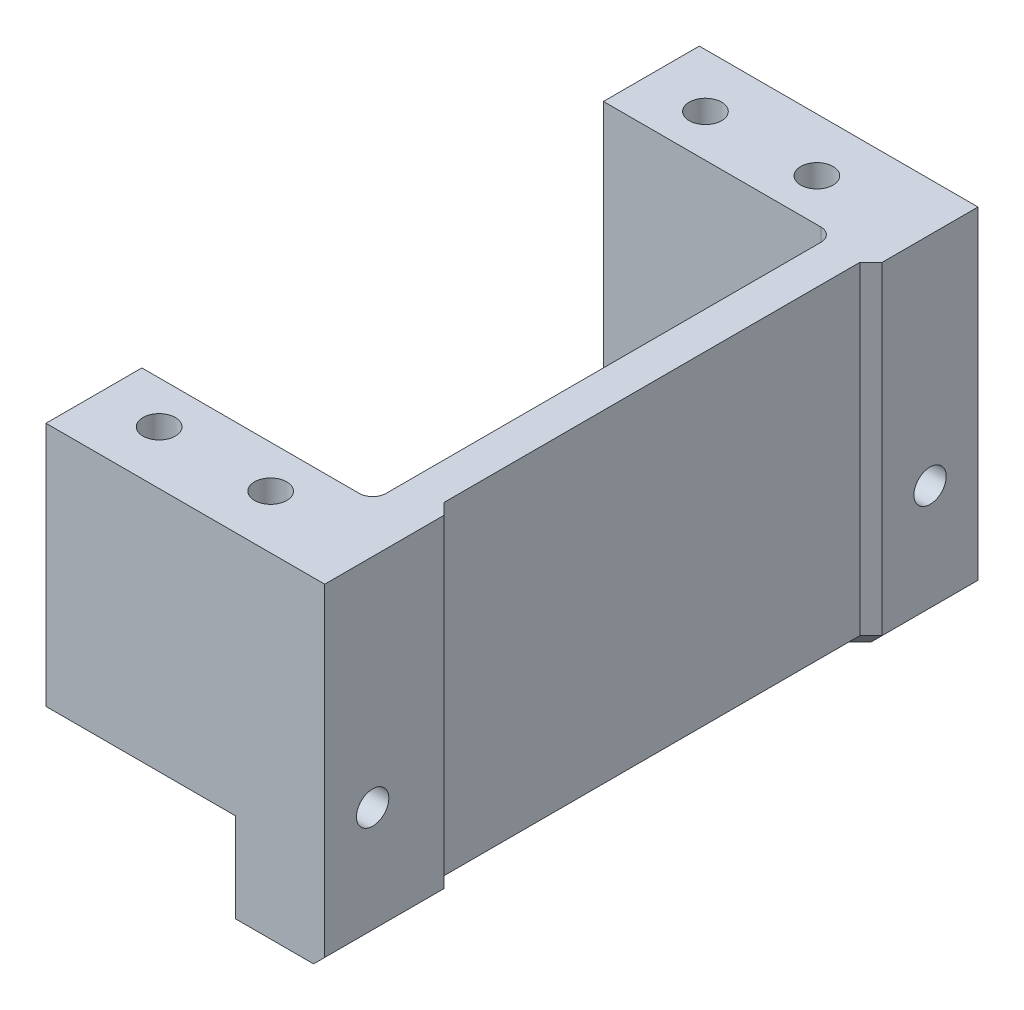
ISO-10303-21;
HEADER;
FILE_DESCRIPTION(('STEP AP214'),'2;1');
FILE_NAME('part.step','',(''),(''),'','','');
FILE_SCHEMA(('AUTOMOTIVE_DESIGN { 1 0 10303 214 1 1 1 1 }'));
ENDSEC;
DATA;
#1=APPLICATION_CONTEXT('core data for automotive mechanical design processes');
#2=APPLICATION_PROTOCOL_DEFINITION('international standard','automotive_design',2000,#1);
#3=PRODUCT_CONTEXT('',#1,'mechanical');
#4=PRODUCT('Part','Part','',(#3));
#5=PRODUCT_RELATED_PRODUCT_CATEGORY('part','',(#4));
#6=PRODUCT_DEFINITION_FORMATION('','',#4);
#7=PRODUCT_DEFINITION_CONTEXT('part definition',#1,'design');
#8=PRODUCT_DEFINITION('design','',#6,#7);
#9=PRODUCT_DEFINITION_SHAPE('','',#8);
#10=(LENGTH_UNIT() NAMED_UNIT(*) SI_UNIT(.MILLI.,.METRE.));
#11=(NAMED_UNIT(*) PLANE_ANGLE_UNIT() SI_UNIT($,.RADIAN.));
#12=(NAMED_UNIT(*) SI_UNIT($,.STERADIAN.) SOLID_ANGLE_UNIT());
#13=UNCERTAINTY_MEASURE_WITH_UNIT(LENGTH_MEASURE(1.E-05),#10,'distance_accuracy_value','');
#14=(GEOMETRIC_REPRESENTATION_CONTEXT(3) GLOBAL_UNCERTAINTY_ASSIGNED_CONTEXT((#13)) GLOBAL_UNIT_ASSIGNED_CONTEXT((#10,
#11,#12)) REPRESENTATION_CONTEXT('',''));
#15=CARTESIAN_POINT('',(0.,0.,0.));
#16=DIRECTION('',(0.,0.,1.));
#17=DIRECTION('',(1.,0.,0.));
#18=AXIS2_PLACEMENT_3D('',#15,#16,#17);
#19=CARTESIAN_POINT('',(10.,0.,19.5));
#20=DIRECTION('',(0.,1.,0.));
#21=DIRECTION('',(0.,0.,1.));
#22=AXIS2_PLACEMENT_3D('',#19,#20,#21);
#23=PLANE('',#22);
#24=DIRECTION('',(-0.707106781186554,0.,-0.707106781186541));
#25=VECTOR('',#24,1.);
#26=CARTESIAN_POINT('',(13.5,0.,17.5906962402754));
#27=LINE('',#26,#25);
#28=CARTESIAN_POINT('',(14.5,0.,18.5906962402754));
#29=VERTEX_POINT('',#28);
#30=CARTESIAN_POINT('',(13.5,0.,17.5906962402754));
#31=VERTEX_POINT('',#30);
#32=EDGE_CURVE('E357',#29,#31,#27,.T.);
#33=ORIENTED_EDGE('',*,*,#32,.F.);
#34=DIRECTION('',(0.,0.,1.));
#35=VECTOR('',#34,1.);
#36=CARTESIAN_POINT('',(14.5,0.,19.5));
#37=LINE('',#36,#35);
#38=CARTESIAN_POINT('',(14.5,0.,29.3));
#39=VERTEX_POINT('',#38);
#40=EDGE_CURVE('E67',#29,#39,#37,.T.);
#41=ORIENTED_EDGE('',*,*,#40,.T.);
#42=DIRECTION('',(1.,0.,0.));
#43=VECTOR('',#42,1.);
#44=CARTESIAN_POINT('',(15.5,0.,29.3));
#45=LINE('',#44,#43);
#46=CARTESIAN_POINT('',(7.50000000000001,0.,29.3));
#47=VERTEX_POINT('',#46);
#48=EDGE_CURVE('E325',#47,#39,#45,.T.);
#49=ORIENTED_EDGE('',*,*,#48,.F.);
#50=DIRECTION('',(0.,0.,1.));
#51=VECTOR('',#50,1.);
#52=CARTESIAN_POINT('',(7.5,0.,20.7));
#53=LINE('',#52,#51);
#54=CARTESIAN_POINT('',(7.5,0.,21.7));
#55=VERTEX_POINT('',#54);
#56=EDGE_CURVE('E582',#55,#47,#53,.T.);
#57=ORIENTED_EDGE('',*,*,#56,.F.);
#58=DIRECTION('',(1.,0.,0.));
#59=VECTOR('',#58,1.);
#60=CARTESIAN_POINT('',(10.,0.,21.7));
#61=LINE('',#60,#59);
#62=CARTESIAN_POINT('',(10.,0.,21.7));
#63=VERTEX_POINT('',#62);
#64=EDGE_CURVE('E375',#55,#63,#61,.T.);
#65=ORIENTED_EDGE('',*,*,#64,.T.);
#66=CARTESIAN_POINT('',(10.,0.,19.5));
#67=DIRECTION('',(0.,1.,0.));
#68=DIRECTION('',(0.,0.,1.));
#69=AXIS2_PLACEMENT_3D('',#66,#67,#68);
#70=CIRCLE('',#69,2.19999999999999);
#71=CARTESIAN_POINT('',(12.2,0.,19.5));
#72=VERTEX_POINT('',#71);
#73=EDGE_CURVE('E369',#63,#72,#70,.T.);
#74=ORIENTED_EDGE('',*,*,#73,.T.);
#75=DIRECTION('',(0.,0.,-1.));
#76=VECTOR('',#75,1.);
#77=CARTESIAN_POINT('',(12.2,0.,19.5));
#78=LINE('',#77,#76);
#79=CARTESIAN_POINT('',(12.2,0.,-19.5));
#80=VERTEX_POINT('',#79);
#81=EDGE_CURVE('E361',#72,#80,#78,.T.);
#82=ORIENTED_EDGE('',*,*,#81,.T.);
#83=CARTESIAN_POINT('',(10.,0.,-19.5));
#84=DIRECTION('',(0.,1.,0.));
#85=DIRECTION('',(0.,0.,1.));
#86=AXIS2_PLACEMENT_3D('',#83,#84,#85);
#87=CIRCLE('',#86,2.19999999999999);
#88=CARTESIAN_POINT('',(10.,0.,-21.7));
#89=VERTEX_POINT('',#88);
#90=EDGE_CURVE('E372',#80,#89,#87,.T.);
#91=ORIENTED_EDGE('',*,*,#90,.T.);
#92=DIRECTION('',(-1.,0.,0.));
#93=VECTOR('',#92,1.);
#94=CARTESIAN_POINT('',(9.99999999999999,0.,-21.7));
#95=LINE('',#94,#93);
#96=CARTESIAN_POINT('',(7.5,0.,-21.7));
#97=VERTEX_POINT('',#96);
#98=EDGE_CURVE('E378',#89,#97,#95,.T.);
#99=ORIENTED_EDGE('',*,*,#98,.T.);
#100=DIRECTION('',(0.,0.,1.));
#101=VECTOR('',#100,1.);
#102=CARTESIAN_POINT('',(7.5,0.,-20.7));
#103=LINE('',#102,#101);
#104=CARTESIAN_POINT('',(7.49999999999999,0.,-29.3));
#105=VERTEX_POINT('',#104);
#106=EDGE_CURVE('E323',#105,#97,#103,.T.);
#107=ORIENTED_EDGE('',*,*,#106,.F.);
#108=DIRECTION('',(-1.,0.,0.));
#109=VECTOR('',#108,1.);
#110=CARTESIAN_POINT('',(-9.5,0.,-29.3));
#111=LINE('',#110,#109);
#112=CARTESIAN_POINT('',(14.5,0.,-29.3));
#113=VERTEX_POINT('',#112);
#114=EDGE_CURVE('E316',#113,#105,#111,.T.);
#115=ORIENTED_EDGE('',*,*,#114,.F.);
#116=DIRECTION('',(0.,0.,1.));
#117=VECTOR('',#116,1.);
#118=CARTESIAN_POINT('',(14.5,0.,19.5));
#119=LINE('',#118,#117);
#120=CARTESIAN_POINT('',(14.5,0.,-20.7));
#121=VERTEX_POINT('',#120);
#122=EDGE_CURVE('E300',#113,#121,#119,.T.);
#123=ORIENTED_EDGE('',*,*,#122,.T.);
#124=DIRECTION('',(0.707106781186552,0.,-0.707106781186543));
#125=VECTOR('',#124,1.);
#126=CARTESIAN_POINT('',(15.5,0.,-21.7));
#127=LINE('',#126,#125);
#128=CARTESIAN_POINT('',(13.5,0.,-19.7));
#129=VERTEX_POINT('',#128);
#130=EDGE_CURVE('E333',#129,#121,#127,.T.);
#131=ORIENTED_EDGE('',*,*,#130,.F.);
#132=DIRECTION('',(0.,0.,1.));
#133=VECTOR('',#132,1.);
#134=CARTESIAN_POINT('',(13.5,0.,19.5));
#135=LINE('',#134,#133);
#136=EDGE_CURVE('E353',#129,#31,#135,.T.);
#137=ORIENTED_EDGE('',*,*,#136,.T.);
#138=EDGE_LOOP('',(#33,#41,#49,#57,#65,#74,#82,#91,#99,#107,#115,#123,#131,#137));
#139=FACE_BOUND('',#138,.T.);
#140=ADVANCED_FACE('F43',(#139),#23,.F.);
#141=CARTESIAN_POINT('',(15.5,30.,-29.3));
#142=DIRECTION('',(-1.,0.,0.));
#143=DIRECTION('',(0.,0.,1.));
#144=AXIS2_PLACEMENT_3D('',#141,#142,#143);
#145=PLANE('',#144);
#146=CARTESIAN_POINT('',(15.5,10.5,-25.));
#147=DIRECTION('',(1.,0.,0.));
#148=DIRECTION('',(0.,0.,-1.));
#149=AXIS2_PLACEMENT_3D('',#146,#147,#148);
#150=CIRCLE('',#149,1.45);
#151=CARTESIAN_POINT('',(15.5,10.5,-26.45));
#152=VERTEX_POINT('',#151);
#153=EDGE_CURVE('E532',#152,#152,#150,.T.);
#154=ORIENTED_EDGE('',*,*,#153,.F.);
#155=EDGE_LOOP('',(#154));
#156=FACE_BOUND('',#155,.T.);
#157=DIRECTION('',(0.,-1.,0.));
#158=VECTOR('',#157,1.);
#159=CARTESIAN_POINT('',(15.5,30.,-20.7));
#160=LINE('',#159,#158);
#161=CARTESIAN_POINT('',(15.5,30.,-20.7));
#162=VERTEX_POINT('',#161);
#163=CARTESIAN_POINT('',(15.5,0.99999999999998,-20.7));
#164=VERTEX_POINT('',#163);
#165=EDGE_CURVE('E238',#162,#164,#160,.T.);
#166=ORIENTED_EDGE('',*,*,#165,.T.);
#167=DIRECTION('',(0.,0.,-1.));
#168=VECTOR('',#167,1.);
#169=CARTESIAN_POINT('',(15.5,1.00000000000001,-29.3));
#170=LINE('',#169,#168);
#171=CARTESIAN_POINT('',(15.5,1.00000000000001,-29.3));
#172=VERTEX_POINT('',#171);
#173=EDGE_CURVE('E308',#164,#172,#170,.T.);
#174=ORIENTED_EDGE('',*,*,#173,.T.);
#175=DIRECTION('',(0.,-1.,0.));
#176=VECTOR('',#175,1.);
#177=CARTESIAN_POINT('',(15.5,30.,-29.3));
#178=LINE('',#177,#176);
#179=CARTESIAN_POINT('',(15.5,30.,-29.3));
#180=VERTEX_POINT('',#179);
#181=EDGE_CURVE('E251',#180,#172,#178,.T.);
#182=ORIENTED_EDGE('',*,*,#181,.F.);
#183=DIRECTION('',(0.,0.,-1.));
#184=VECTOR('',#183,1.);
#185=CARTESIAN_POINT('',(15.5,30.,-29.3));
#186=LINE('',#185,#184);
#187=EDGE_CURVE('E252',#162,#180,#186,.T.);
#188=ORIENTED_EDGE('',*,*,#187,.F.);
#189=EDGE_LOOP('',(#166,#174,#182,#188));
#190=FACE_BOUND('',#189,.T.);
#191=ADVANCED_FACE('F337',(#156,#190),#145,.F.);
#192=CARTESIAN_POINT('',(-9.5,30.,-29.3));
#193=DIRECTION('',(0.,0.,1.));
#194=DIRECTION('',(1.,0.,0.));
#195=AXIS2_PLACEMENT_3D('',#192,#193,#194);
#196=PLANE('',#195);
#197=ORIENTED_EDGE('',*,*,#181,.T.);
#198=DIRECTION('',(0.707106781186548,0.707106781186548,0.));
#199=VECTOR('',#198,1.);
#200=CARTESIAN_POINT('',(15.5,1.00000000000001,-29.3));
#201=LINE('',#200,#199);
#202=EDGE_CURVE('E53',#172,#113,#201,.F.);
#203=ORIENTED_EDGE('',*,*,#202,.T.);
#204=ORIENTED_EDGE('',*,*,#114,.T.);
#205=DIRECTION('',(0.,-1.,0.));
#206=VECTOR('',#205,1.);
#207=CARTESIAN_POINT('',(7.49999999999999,0.,-29.3));
#208=LINE('',#207,#206);
#209=CARTESIAN_POINT('',(7.49999999999999,8.,-29.3));
#210=VERTEX_POINT('',#209);
#211=EDGE_CURVE('E557',#210,#105,#208,.T.);
#212=ORIENTED_EDGE('',*,*,#211,.F.);
#213=DIRECTION('',(-1.,0.,0.));
#214=VECTOR('',#213,1.);
#215=CARTESIAN_POINT('',(7.49999999999999,8.,-29.3));
#216=LINE('',#215,#214);
#217=CARTESIAN_POINT('',(-9.50000000000001,8.,-29.3));
#218=VERTEX_POINT('',#217);
#219=EDGE_CURVE('E548',#210,#218,#216,.T.);
#220=ORIENTED_EDGE('',*,*,#219,.T.);
#221=DIRECTION('',(0.,-1.,0.));
#222=VECTOR('',#221,1.);
#223=CARTESIAN_POINT('',(-9.5,30.,-29.3));
#224=LINE('',#223,#222);
#225=CARTESIAN_POINT('',(-9.5,30.,-29.3));
#226=VERTEX_POINT('',#225);
#227=EDGE_CURVE('E446',#226,#218,#224,.T.);
#228=ORIENTED_EDGE('',*,*,#227,.F.);
#229=DIRECTION('',(-1.,0.,0.));
#230=VECTOR('',#229,1.);
#231=CARTESIAN_POINT('',(-9.5,30.,-29.3));
#232=LINE('',#231,#230);
#233=EDGE_CURVE('E490',#180,#226,#232,.T.);
#234=ORIENTED_EDGE('',*,*,#233,.F.);
#235=EDGE_LOOP('',(#197,#203,#204,#212,#220,#228,#234));
#236=FACE_BOUND('',#235,.T.);
#237=ADVANCED_FACE('F314',(#236),#196,.F.);
#238=CARTESIAN_POINT('',(-9.50000000000001,30.,-20.7));
#239=DIRECTION('',(1.,0.,0.));
#240=DIRECTION('',(0.,0.,-1.));
#241=AXIS2_PLACEMENT_3D('',#238,#239,#240);
#242=PLANE('',#241);
#243=ORIENTED_EDGE('',*,*,#227,.T.);
#244=DIRECTION('',(0.,0.,-1.));
#245=VECTOR('',#244,1.);
#246=CARTESIAN_POINT('',(-9.50000000000001,8.,-20.7));
#247=LINE('',#246,#245);
#248=CARTESIAN_POINT('',(-9.50000000000001,8.,-20.7));
#249=VERTEX_POINT('',#248);
#250=EDGE_CURVE('E341',#249,#218,#247,.T.);
#251=ORIENTED_EDGE('',*,*,#250,.F.);
#252=DIRECTION('',(0.,-1.,0.));
#253=VECTOR('',#252,1.);
#254=CARTESIAN_POINT('',(-9.50000000000001,30.,-20.7));
#255=LINE('',#254,#253);
#256=CARTESIAN_POINT('',(-9.50000000000001,30.,-20.7));
#257=VERTEX_POINT('',#256);
#258=EDGE_CURVE('E442',#257,#249,#255,.T.);
#259=ORIENTED_EDGE('',*,*,#258,.F.);
#260=DIRECTION('',(0.,0.,1.));
#261=VECTOR('',#260,1.);
#262=CARTESIAN_POINT('',(-9.50000000000001,30.,-20.7));
#263=LINE('',#262,#261);
#264=EDGE_CURVE('E476',#226,#257,#263,.T.);
#265=ORIENTED_EDGE('',*,*,#264,.F.);
#266=EDGE_LOOP('',(#243,#251,#259,#265));
#267=FACE_BOUND('',#266,.T.);
#268=ADVANCED_FACE('F592',(#267),#242,.F.);
#269=CARTESIAN_POINT('',(10.,30.,-20.7));
#270=DIRECTION('',(0.,0.,-1.));
#271=DIRECTION('',(-1.,0.,0.));
#272=AXIS2_PLACEMENT_3D('',#269,#270,#271);
#273=PLANE('',#272);
#274=DIRECTION('',(0.,1.,0.));
#275=VECTOR('',#274,1.);
#276=CARTESIAN_POINT('',(7.5,0.,-20.7));
#277=LINE('',#276,#275);
#278=CARTESIAN_POINT('',(7.5,0.999999999999994,-20.7));
#279=VERTEX_POINT('',#278);
#280=CARTESIAN_POINT('',(7.5,8.,-20.7));
#281=VERTEX_POINT('',#280);
#282=EDGE_CURVE('E459',#279,#281,#277,.T.);
#283=ORIENTED_EDGE('',*,*,#282,.F.);
#284=DIRECTION('',(1.,0.,0.));
#285=VECTOR('',#284,1.);
#286=CARTESIAN_POINT('',(10.,0.999999999999994,-20.7));
#287=LINE('',#286,#285);
#288=CARTESIAN_POINT('',(10.,0.999999999999994,-20.7));
#289=VERTEX_POINT('',#288);
#290=EDGE_CURVE('E363',#279,#289,#287,.T.);
#291=ORIENTED_EDGE('',*,*,#290,.T.);
#292=DIRECTION('',(0.,-1.,0.));
#293=VECTOR('',#292,1.);
#294=CARTESIAN_POINT('',(10.,30.,-20.7));
#295=LINE('',#294,#293);
#296=CARTESIAN_POINT('',(10.,30.,-20.7));
#297=VERTEX_POINT('',#296);
#298=EDGE_CURVE('E438',#297,#289,#295,.T.);
#299=ORIENTED_EDGE('',*,*,#298,.F.);
#300=DIRECTION('',(1.,0.,0.));
#301=VECTOR('',#300,1.);
#302=CARTESIAN_POINT('',(10.,30.,-20.7));
#303=LINE('',#302,#301);
#304=EDGE_CURVE('E470',#257,#297,#303,.T.);
#305=ORIENTED_EDGE('',*,*,#304,.F.);
#306=ORIENTED_EDGE('',*,*,#258,.T.);
#307=DIRECTION('',(-1.,0.,0.));
#308=VECTOR('',#307,1.);
#309=CARTESIAN_POINT('',(7.5,8.,-20.7));
#310=LINE('',#309,#308);
#311=EDGE_CURVE('E545',#281,#249,#310,.T.);
#312=ORIENTED_EDGE('',*,*,#311,.F.);
#313=EDGE_LOOP('',(#283,#291,#299,#305,#306,#312));
#314=FACE_BOUND('',#313,.T.);
#315=ADVANCED_FACE('F455',(#314),#273,.F.);
#316=CARTESIAN_POINT('',(10.,30.,-19.5));
#317=DIRECTION('',(0.,-1.,0.));
#318=DIRECTION('',(0.,0.,-1.));
#319=AXIS2_PLACEMENT_3D('',#316,#317,#318);
#320=CYLINDRICAL_SURFACE('',#319,1.2);
#321=ORIENTED_EDGE('',*,*,#298,.T.);
#322=CARTESIAN_POINT('',(10.,0.999999999999994,-19.5));
#323=DIRECTION('',(0.,1.,0.));
#324=DIRECTION('',(0.,0.,1.));
#325=AXIS2_PLACEMENT_3D('',#322,#323,#324);
#326=CIRCLE('',#325,1.2);
#327=CARTESIAN_POINT('',(11.2,0.999999999999994,-19.5));
#328=VERTEX_POINT('',#327);
#329=EDGE_CURVE('E390',#289,#328,#326,.F.);
#330=ORIENTED_EDGE('',*,*,#329,.T.);
#331=DIRECTION('',(0.,-1.,0.));
#332=VECTOR('',#331,1.);
#333=CARTESIAN_POINT('',(11.2,30.,-19.5));
#334=LINE('',#333,#332);
#335=CARTESIAN_POINT('',(11.2,30.,-19.5));
#336=VERTEX_POINT('',#335);
#337=EDGE_CURVE('E434',#336,#328,#334,.T.);
#338=ORIENTED_EDGE('',*,*,#337,.F.);
#339=CARTESIAN_POINT('',(10.,30.,-19.5));
#340=DIRECTION('',(0.,-1.,0.));
#341=DIRECTION('',(0.,0.,1.));
#342=AXIS2_PLACEMENT_3D('',#339,#340,#341);
#343=CIRCLE('',#342,1.2);
#344=EDGE_CURVE('E466',#297,#336,#343,.T.);
#345=ORIENTED_EDGE('',*,*,#344,.F.);
#346=EDGE_LOOP('',(#321,#330,#338,#345));
#347=FACE_BOUND('',#346,.T.);
#348=ADVANCED_FACE('F463',(#347),#320,.F.);
#349=CARTESIAN_POINT('',(11.2,30.,19.5));
#350=DIRECTION('',(1.,0.,0.));
#351=DIRECTION('',(0.,0.,-1.));
#352=AXIS2_PLACEMENT_3D('',#349,#350,#351);
#353=PLANE('',#352);
#354=ORIENTED_EDGE('',*,*,#337,.T.);
#355=DIRECTION('',(0.,0.,1.));
#356=VECTOR('',#355,1.);
#357=CARTESIAN_POINT('',(11.2,0.999999999999994,19.5));
#358=LINE('',#357,#356);
#359=CARTESIAN_POINT('',(11.2,0.999999999999994,19.5));
#360=VERTEX_POINT('',#359);
#361=EDGE_CURVE('E396',#328,#360,#358,.T.);
#362=ORIENTED_EDGE('',*,*,#361,.T.);
#363=DIRECTION('',(0.,-1.,0.));
#364=VECTOR('',#363,1.);
#365=CARTESIAN_POINT('',(11.2,30.,19.5));
#366=LINE('',#365,#364);
#367=CARTESIAN_POINT('',(11.2,30.,19.5));
#368=VERTEX_POINT('',#367);
#369=EDGE_CURVE('E430',#368,#360,#366,.T.);
#370=ORIENTED_EDGE('',*,*,#369,.F.);
#371=DIRECTION('',(0.,0.,1.));
#372=VECTOR('',#371,1.);
#373=CARTESIAN_POINT('',(11.2,30.,19.5));
#374=LINE('',#373,#372);
#375=EDGE_CURVE('E469',#336,#368,#374,.T.);
#376=ORIENTED_EDGE('',*,*,#375,.F.);
#377=EDGE_LOOP('',(#354,#362,#370,#376));
#378=FACE_BOUND('',#377,.T.);
#379=ADVANCED_FACE('F613',(#378),#353,.F.);
#380=CARTESIAN_POINT('',(10.,30.,19.5));
#381=DIRECTION('',(0.,-1.,0.));
#382=DIRECTION('',(0.,0.,-1.));
#383=AXIS2_PLACEMENT_3D('',#380,#381,#382);
#384=CYLINDRICAL_SURFACE('',#383,1.2);
#385=ORIENTED_EDGE('',*,*,#369,.T.);
#386=CARTESIAN_POINT('',(10.,0.999999999999994,19.5));
#387=DIRECTION('',(0.,1.,0.));
#388=DIRECTION('',(0.,0.,1.));
#389=AXIS2_PLACEMENT_3D('',#386,#387,#388);
#390=CIRCLE('',#389,1.2);
#391=CARTESIAN_POINT('',(10.,0.999999999999994,20.7));
#392=VERTEX_POINT('',#391);
#393=EDGE_CURVE('E393',#360,#392,#390,.F.);
#394=ORIENTED_EDGE('',*,*,#393,.T.);
#395=DIRECTION('',(0.,-1.,0.));
#396=VECTOR('',#395,1.);
#397=CARTESIAN_POINT('',(10.,30.,20.7));
#398=LINE('',#397,#396);
#399=CARTESIAN_POINT('',(10.,30.,20.7));
#400=VERTEX_POINT('',#399);
#401=EDGE_CURVE('E426',#400,#392,#398,.T.);
#402=ORIENTED_EDGE('',*,*,#401,.F.);
#403=CARTESIAN_POINT('',(10.,30.,19.5));
#404=DIRECTION('',(0.,-1.,0.));
#405=DIRECTION('',(0.,0.,1.));
#406=AXIS2_PLACEMENT_3D('',#403,#404,#405);
#407=CIRCLE('',#406,1.2);
#408=EDGE_CURVE('E474',#368,#400,#407,.T.);
#409=ORIENTED_EDGE('',*,*,#408,.F.);
#410=EDGE_LOOP('',(#385,#394,#402,#409));
#411=FACE_BOUND('',#410,.T.);
#412=ADVANCED_FACE('F617',(#411),#384,.F.);
#413=CARTESIAN_POINT('',(-9.5,30.,20.7));
#414=DIRECTION('',(0.,0.,1.));
#415=DIRECTION('',(1.,0.,0.));
#416=AXIS2_PLACEMENT_3D('',#413,#414,#415);
#417=PLANE('',#416);
#418=ORIENTED_EDGE('',*,*,#401,.T.);
#419=DIRECTION('',(-1.,0.,0.));
#420=VECTOR('',#419,1.);
#421=CARTESIAN_POINT('',(-9.5,0.999999999999994,20.7));
#422=LINE('',#421,#420);
#423=CARTESIAN_POINT('',(7.5,0.999999999999994,20.7));
#424=VERTEX_POINT('',#423);
#425=EDGE_CURVE('E384',#392,#424,#422,.T.);
#426=ORIENTED_EDGE('',*,*,#425,.T.);
#427=DIRECTION('',(0.,-1.,0.));
#428=VECTOR('',#427,1.);
#429=CARTESIAN_POINT('',(7.5,0.,20.7));
#430=LINE('',#429,#428);
#431=CARTESIAN_POINT('',(7.5,8.,20.7));
#432=VERTEX_POINT('',#431);
#433=EDGE_CURVE('E575',#432,#424,#430,.T.);
#434=ORIENTED_EDGE('',*,*,#433,.F.);
#435=DIRECTION('',(-1.,0.,0.));
#436=VECTOR('',#435,1.);
#437=CARTESIAN_POINT('',(7.5,8.,20.7));
#438=LINE('',#437,#436);
#439=CARTESIAN_POINT('',(-9.5,8.,20.7));
#440=VERTEX_POINT('',#439);
#441=EDGE_CURVE('E544',#432,#440,#438,.T.);
#442=ORIENTED_EDGE('',*,*,#441,.T.);
#443=DIRECTION('',(0.,-1.,0.));
#444=VECTOR('',#443,1.);
#445=CARTESIAN_POINT('',(-9.5,30.,20.7));
#446=LINE('',#445,#444);
#447=CARTESIAN_POINT('',(-9.5,30.,20.7));
#448=VERTEX_POINT('',#447);
#449=EDGE_CURVE('E418',#448,#440,#446,.T.);
#450=ORIENTED_EDGE('',*,*,#449,.F.);
#451=DIRECTION('',(-1.,0.,0.));
#452=VECTOR('',#451,1.);
#453=CARTESIAN_POINT('',(-9.5,30.,20.7));
#454=LINE('',#453,#452);
#455=EDGE_CURVE('E482',#400,#448,#454,.T.);
#456=ORIENTED_EDGE('',*,*,#455,.F.);
#457=EDGE_LOOP('',(#418,#426,#434,#442,#450,#456));
#458=FACE_BOUND('',#457,.T.);
#459=ADVANCED_FACE('F630',(#458),#417,.F.);
#460=CARTESIAN_POINT('',(-9.5,30.,29.3));
#461=DIRECTION('',(1.,0.,0.));
#462=DIRECTION('',(0.,0.,-1.));
#463=AXIS2_PLACEMENT_3D('',#460,#461,#462);
#464=PLANE('',#463);
#465=ORIENTED_EDGE('',*,*,#449,.T.);
#466=DIRECTION('',(0.,0.,-1.));
#467=VECTOR('',#466,1.);
#468=CARTESIAN_POINT('',(-9.5,8.,20.7));
#469=LINE('',#468,#467);
#470=CARTESIAN_POINT('',(-9.5,8.,29.3));
#471=VERTEX_POINT('',#470);
#472=EDGE_CURVE('E552',#471,#440,#469,.T.);
#473=ORIENTED_EDGE('',*,*,#472,.F.);
#474=DIRECTION('',(0.,-1.,0.));
#475=VECTOR('',#474,1.);
#476=CARTESIAN_POINT('',(-9.5,30.,29.3));
#477=LINE('',#476,#475);
#478=CARTESIAN_POINT('',(-9.5,30.,29.3));
#479=VERTEX_POINT('',#478);
#480=EDGE_CURVE('E413',#479,#471,#477,.T.);
#481=ORIENTED_EDGE('',*,*,#480,.F.);
#482=DIRECTION('',(0.,0.,1.));
#483=VECTOR('',#482,1.);
#484=CARTESIAN_POINT('',(-9.5,30.,29.3));
#485=LINE('',#484,#483);
#486=EDGE_CURVE('E485',#448,#479,#485,.T.);
#487=ORIENTED_EDGE('',*,*,#486,.F.);
#488=EDGE_LOOP('',(#465,#473,#481,#487));
#489=FACE_BOUND('',#488,.T.);
#490=ADVANCED_FACE('F643',(#489),#464,.F.);
#491=CARTESIAN_POINT('',(15.5,30.,29.3));
#492=DIRECTION('',(0.,0.,-1.));
#493=DIRECTION('',(-1.,0.,0.));
#494=AXIS2_PLACEMENT_3D('',#491,#492,#493);
#495=PLANE('',#494);
#496=ORIENTED_EDGE('',*,*,#48,.T.);
#497=DIRECTION('',(-0.707106781186548,-0.707106781186548,0.));
#498=VECTOR('',#497,1.);
#499=CARTESIAN_POINT('',(15.5,1.00000000000001,29.3));
#500=LINE('',#499,#498);
#501=CARTESIAN_POINT('',(15.5,1.00000000000001,29.3));
#502=VERTEX_POINT('',#501);
#503=EDGE_CURVE('E305',#39,#502,#500,.F.);
#504=ORIENTED_EDGE('',*,*,#503,.T.);
#505=DIRECTION('',(0.,-1.,0.));
#506=VECTOR('',#505,1.);
#507=CARTESIAN_POINT('',(15.5,30.,29.3));
#508=LINE('',#507,#506);
#509=CARTESIAN_POINT('',(15.5,30.,29.3));
#510=VERTEX_POINT('',#509);
#511=EDGE_CURVE('E410',#510,#502,#508,.T.);
#512=ORIENTED_EDGE('',*,*,#511,.F.);
#513=DIRECTION('',(1.,0.,0.));
#514=VECTOR('',#513,1.);
#515=CARTESIAN_POINT('',(15.5,30.,29.3));
#516=LINE('',#515,#514);
#517=EDGE_CURVE('E248',#479,#510,#516,.T.);
#518=ORIENTED_EDGE('',*,*,#517,.F.);
#519=ORIENTED_EDGE('',*,*,#480,.T.);
#520=DIRECTION('',(-1.,0.,0.));
#521=VECTOR('',#520,1.);
#522=CARTESIAN_POINT('',(7.50000000000001,8.,29.3));
#523=LINE('',#522,#521);
#524=CARTESIAN_POINT('',(7.50000000000001,8.,29.3));
#525=VERTEX_POINT('',#524);
#526=EDGE_CURVE('E566',#525,#471,#523,.T.);
#527=ORIENTED_EDGE('',*,*,#526,.F.);
#528=DIRECTION('',(0.,1.,0.));
#529=VECTOR('',#528,1.);
#530=CARTESIAN_POINT('',(7.50000000000001,0.,29.3));
#531=LINE('',#530,#529);
#532=EDGE_CURVE('E579',#47,#525,#531,.T.);
#533=ORIENTED_EDGE('',*,*,#532,.F.);
#534=EDGE_LOOP('',(#496,#504,#512,#518,#519,#527,#533));
#535=FACE_BOUND('',#534,.T.);
#536=ADVANCED_FACE('F409',(#535),#495,.F.);
#537=CARTESIAN_POINT('',(15.5,10.5,25.));
#538=DIRECTION('',(1.,0.,0.));
#539=DIRECTION('',(0.,0.,-1.));
#540=AXIS2_PLACEMENT_3D('',#537,#538,#539);
#541=CIRCLE('',#540,1.45);
#542=CARTESIAN_POINT('',(15.5,10.5,23.55));
#543=VERTEX_POINT('',#542);
#544=EDGE_CURVE('E540',#543,#543,#541,.T.);
#545=ORIENTED_EDGE('',*,*,#544,.F.);
#546=EDGE_LOOP('',(#545));
#547=FACE_BOUND('',#546,.T.);
#548=ORIENTED_EDGE('',*,*,#511,.T.);
#549=DIRECTION('',(0.,0.,-1.));
#550=VECTOR('',#549,1.);
#551=CARTESIAN_POINT('',(15.5,1.00000000000001,-29.3));
#552=LINE('',#551,#550);
#553=CARTESIAN_POINT('',(15.5,0.99999999999998,18.5906962402754));
#554=VERTEX_POINT('',#553);
#555=EDGE_CURVE('E232',#502,#554,#552,.T.);
#556=ORIENTED_EDGE('',*,*,#555,.T.);
#557=DIRECTION('',(0.,-1.,0.));
#558=VECTOR('',#557,1.);
#559=CARTESIAN_POINT('',(15.5,30.,18.5906962402754));
#560=LINE('',#559,#558);
#561=CARTESIAN_POINT('',(15.5,30.,18.5906962402754));
#562=VERTEX_POINT('',#561);
#563=EDGE_CURVE('E226',#562,#554,#560,.T.);
#564=ORIENTED_EDGE('',*,*,#563,.F.);
#565=EDGE_CURVE('E230',#510,#562,#186,.T.);
#566=ORIENTED_EDGE('',*,*,#565,.F.);
#567=EDGE_LOOP('',(#548,#556,#564,#566));
#568=FACE_BOUND('',#567,.T.);
#569=ADVANCED_FACE('F229',(#547,#568),#145,.F.);
#570=CARTESIAN_POINT('',(10.,30.,19.5));
#571=DIRECTION('',(0.,1.,0.));
#572=DIRECTION('',(0.,0.,1.));
#573=AXIS2_PLACEMENT_3D('',#570,#571,#572);
#574=PLANE('',#573);
#575=DIRECTION('',(0.,0.,-1.));
#576=VECTOR('',#575,1.);
#577=CARTESIAN_POINT('',(14.5,30.,18.5906962402754));
#578=LINE('',#577,#576);
#579=CARTESIAN_POINT('',(14.5,30.,17.5906962402754));
#580=VERTEX_POINT('',#579);
#581=CARTESIAN_POINT('',(14.5,30.,-19.7));
#582=VERTEX_POINT('',#581);
#583=EDGE_CURVE('E239',#580,#582,#578,.T.);
#584=ORIENTED_EDGE('',*,*,#583,.T.);
#585=DIRECTION('',(-0.707106781186552,0.,0.707106781186543));
#586=VECTOR('',#585,1.);
#587=CARTESIAN_POINT('',(15.5,30.,-20.7));
#588=LINE('',#587,#586);
#589=EDGE_CURVE('E258',#582,#162,#588,.F.);
#590=ORIENTED_EDGE('',*,*,#589,.T.);
#591=ORIENTED_EDGE('',*,*,#187,.T.);
#592=ORIENTED_EDGE('',*,*,#233,.T.);
#593=ORIENTED_EDGE('',*,*,#264,.T.);
#594=ORIENTED_EDGE('',*,*,#304,.T.);
#595=ORIENTED_EDGE('',*,*,#344,.T.);
#596=ORIENTED_EDGE('',*,*,#375,.T.);
#597=ORIENTED_EDGE('',*,*,#408,.T.);
#598=ORIENTED_EDGE('',*,*,#455,.T.);
#599=ORIENTED_EDGE('',*,*,#486,.T.);
#600=ORIENTED_EDGE('',*,*,#517,.T.);
#601=ORIENTED_EDGE('',*,*,#565,.T.);
#602=DIRECTION('',(0.707106781186554,0.,0.707106781186541));
#603=VECTOR('',#602,1.);
#604=CARTESIAN_POINT('',(14.5,30.,17.5906962402754));
#605=LINE('',#604,#603);
#606=EDGE_CURVE('E245',#562,#580,#605,.F.);
#607=ORIENTED_EDGE('',*,*,#606,.T.);
#608=EDGE_LOOP('',(#584,#590,#591,#592,#593,#594,#595,#596,#597,#598,#599,#600,#601,#607));
#609=FACE_BOUND('',#608,.T.);
#610=CARTESIAN_POINT('',(-4.15,30.,-24.5));
#611=DIRECTION('',(0.,1.,0.));
#612=DIRECTION('',(0.,0.,1.));
#613=AXIS2_PLACEMENT_3D('',#610,#611,#612);
#614=CIRCLE('',#613,1.45);
#615=CARTESIAN_POINT('',(-4.15,30.,-23.05));
#616=VERTEX_POINT('',#615);
#617=EDGE_CURVE('E524',#616,#616,#614,.T.);
#618=ORIENTED_EDGE('',*,*,#617,.F.);
#619=EDGE_LOOP('',(#618));
#620=FACE_BOUND('',#619,.T.);
#621=CARTESIAN_POINT('',(-4.15,30.,24.5));
#622=DIRECTION('',(0.,1.,0.));
#623=DIRECTION('',(0.,0.,1.));
#624=AXIS2_PLACEMENT_3D('',#621,#622,#623);
#625=CIRCLE('',#624,1.45);
#626=CARTESIAN_POINT('',(-4.15,30.,25.95));
#627=VERTEX_POINT('',#626);
#628=EDGE_CURVE('E516',#627,#627,#625,.T.);
#629=ORIENTED_EDGE('',*,*,#628,.F.);
#630=EDGE_LOOP('',(#629));
#631=FACE_BOUND('',#630,.T.);
#632=CARTESIAN_POINT('',(5.84999999999999,30.,24.5));
#633=DIRECTION('',(0.,1.,0.));
#634=DIRECTION('',(0.,0.,1.));
#635=AXIS2_PLACEMENT_3D('',#632,#633,#634);
#636=CIRCLE('',#635,1.45);
#637=CARTESIAN_POINT('',(5.84999999999999,30.,25.95));
#638=VERTEX_POINT('',#637);
#639=EDGE_CURVE('E508',#638,#638,#636,.T.);
#640=ORIENTED_EDGE('',*,*,#639,.F.);
#641=EDGE_LOOP('',(#640));
#642=FACE_BOUND('',#641,.T.);
#643=CARTESIAN_POINT('',(5.84999999999999,30.,-24.5));
#644=DIRECTION('',(0.,1.,0.));
#645=DIRECTION('',(0.,0.,1.));
#646=AXIS2_PLACEMENT_3D('',#643,#644,#645);
#647=CIRCLE('',#646,1.45);
#648=CARTESIAN_POINT('',(5.84999999999999,30.,-23.05));
#649=VERTEX_POINT('',#648);
#650=EDGE_CURVE('E500',#649,#649,#647,.T.);
#651=ORIENTED_EDGE('',*,*,#650,.F.);
#652=EDGE_LOOP('',(#651));
#653=FACE_BOUND('',#652,.T.);
#654=ADVANCED_FACE('F243',(#609,#620,#631,#642,#653),#574,.T.);
#655=CARTESIAN_POINT('',(5.84999999999999,20.,-24.5));
#656=DIRECTION('',(0.,1.,0.));
#657=DIRECTION('',(0.,0.,1.));
#658=AXIS2_PLACEMENT_3D('',#655,#656,#657);
#659=CONICAL_SURFACE('',#658,1.45,1.02974425867665);
#660=CARTESIAN_POINT('',(5.84999999999999,19.12875210241,-24.5));
#661=VERTEX_POINT('',#660);
#662=VERTEX_LOOP('',#661);
#663=FACE_BOUND('',#662,.T.);
#664=CARTESIAN_POINT('',(5.84999999999999,20.,-24.5));
#665=DIRECTION('',(0.,1.,0.));
#666=DIRECTION('',(0.,0.,1.));
#667=AXIS2_PLACEMENT_3D('',#664,#665,#666);
#668=CIRCLE('',#667,1.45);
#669=CARTESIAN_POINT('',(5.84999999999999,20.,-23.05));
#670=VERTEX_POINT('',#669);
#671=EDGE_CURVE('E326',#670,#670,#668,.T.);
#672=ORIENTED_EDGE('',*,*,#671,.T.);
#673=EDGE_LOOP('',(#672));
#674=FACE_BOUND('',#673,.T.);
#675=ADVANCED_FACE('F667',(#663,#674),#659,.F.);
#676=CARTESIAN_POINT('',(5.84999999999999,30.,-24.5));
#677=DIRECTION('',(0.,1.,0.));
#678=DIRECTION('',(0.,0.,1.));
#679=AXIS2_PLACEMENT_3D('',#676,#677,#678);
#680=CYLINDRICAL_SURFACE('',#679,1.45);
#681=ORIENTED_EDGE('',*,*,#671,.F.);
#682=EDGE_LOOP('',(#681));
#683=FACE_BOUND('',#682,.T.);
#684=ORIENTED_EDGE('',*,*,#650,.T.);
#685=EDGE_LOOP('',(#684));
#686=FACE_BOUND('',#685,.T.);
#687=ADVANCED_FACE('F716',(#683,#686),#680,.F.);
#688=CARTESIAN_POINT('',(5.84999999999999,20.,24.5));
#689=DIRECTION('',(0.,1.,0.));
#690=DIRECTION('',(0.,0.,1.));
#691=AXIS2_PLACEMENT_3D('',#688,#689,#690);
#692=CONICAL_SURFACE('',#691,1.45,1.02974425867665);
#693=CARTESIAN_POINT('',(5.84999999999999,19.12875210241,24.5));
#694=VERTEX_POINT('',#693);
#695=VERTEX_LOOP('',#694);
#696=FACE_BOUND('',#695,.T.);
#697=CARTESIAN_POINT('',(5.84999999999999,20.,24.5));
#698=DIRECTION('',(0.,1.,0.));
#699=DIRECTION('',(0.,0.,1.));
#700=AXIS2_PLACEMENT_3D('',#697,#698,#699);
#701=CIRCLE('',#700,1.45);
#702=CARTESIAN_POINT('',(5.84999999999999,20.,25.95));
#703=VERTEX_POINT('',#702);
#704=EDGE_CURVE('E504',#703,#703,#701,.T.);
#705=ORIENTED_EDGE('',*,*,#704,.T.);
#706=EDGE_LOOP('',(#705));
#707=FACE_BOUND('',#706,.T.);
#708=ADVANCED_FACE('F712',(#696,#707),#692,.F.);
#709=CARTESIAN_POINT('',(5.84999999999999,30.,24.5));
#710=DIRECTION('',(0.,1.,0.));
#711=DIRECTION('',(0.,0.,1.));
#712=AXIS2_PLACEMENT_3D('',#709,#710,#711);
#713=CYLINDRICAL_SURFACE('',#712,1.45);
#714=ORIENTED_EDGE('',*,*,#704,.F.);
#715=EDGE_LOOP('',(#714));
#716=FACE_BOUND('',#715,.T.);
#717=ORIENTED_EDGE('',*,*,#639,.T.);
#718=EDGE_LOOP('',(#717));
#719=FACE_BOUND('',#718,.T.);
#720=ADVANCED_FACE('F708',(#716,#719),#713,.F.);
#721=CARTESIAN_POINT('',(-4.15,20.,24.5));
#722=DIRECTION('',(0.,1.,0.));
#723=DIRECTION('',(0.,0.,1.));
#724=AXIS2_PLACEMENT_3D('',#721,#722,#723);
#725=CONICAL_SURFACE('',#724,1.45,1.02974425867665);
#726=CARTESIAN_POINT('',(-4.15,19.12875210241,24.5));
#727=VERTEX_POINT('',#726);
#728=VERTEX_LOOP('',#727);
#729=FACE_BOUND('',#728,.T.);
#730=CARTESIAN_POINT('',(-4.15,20.,24.5));
#731=DIRECTION('',(0.,1.,0.));
#732=DIRECTION('',(0.,0.,1.));
#733=AXIS2_PLACEMENT_3D('',#730,#731,#732);
#734=CIRCLE('',#733,1.45);
#735=CARTESIAN_POINT('',(-4.15,20.,25.95));
#736=VERTEX_POINT('',#735);
#737=EDGE_CURVE('E512',#736,#736,#734,.T.);
#738=ORIENTED_EDGE('',*,*,#737,.T.);
#739=EDGE_LOOP('',(#738));
#740=FACE_BOUND('',#739,.T.);
#741=ADVANCED_FACE('F704',(#729,#740),#725,.F.);
#742=CARTESIAN_POINT('',(-4.15,30.,24.5));
#743=DIRECTION('',(0.,1.,0.));
#744=DIRECTION('',(0.,0.,1.));
#745=AXIS2_PLACEMENT_3D('',#742,#743,#744);
#746=CYLINDRICAL_SURFACE('',#745,1.45);
#747=ORIENTED_EDGE('',*,*,#737,.F.);
#748=EDGE_LOOP('',(#747));
#749=FACE_BOUND('',#748,.T.);
#750=ORIENTED_EDGE('',*,*,#628,.T.);
#751=EDGE_LOOP('',(#750));
#752=FACE_BOUND('',#751,.T.);
#753=ADVANCED_FACE('F700',(#749,#752),#746,.F.);
#754=CARTESIAN_POINT('',(-4.15,20.,-24.5));
#755=DIRECTION('',(0.,1.,0.));
#756=DIRECTION('',(0.,0.,1.));
#757=AXIS2_PLACEMENT_3D('',#754,#755,#756);
#758=CONICAL_SURFACE('',#757,1.45,1.02974425867665);
#759=CARTESIAN_POINT('',(-4.15,19.12875210241,-24.5));
#760=VERTEX_POINT('',#759);
#761=VERTEX_LOOP('',#760);
#762=FACE_BOUND('',#761,.T.);
#763=CARTESIAN_POINT('',(-4.15,20.,-24.5));
#764=DIRECTION('',(0.,1.,0.));
#765=DIRECTION('',(0.,0.,1.));
#766=AXIS2_PLACEMENT_3D('',#763,#764,#765);
#767=CIRCLE('',#766,1.45);
#768=CARTESIAN_POINT('',(-4.15,20.,-23.05));
#769=VERTEX_POINT('',#768);
#770=EDGE_CURVE('E520',#769,#769,#767,.T.);
#771=ORIENTED_EDGE('',*,*,#770,.T.);
#772=EDGE_LOOP('',(#771));
#773=FACE_BOUND('',#772,.T.);
#774=ADVANCED_FACE('F696',(#762,#773),#758,.F.);
#775=CARTESIAN_POINT('',(-4.15,30.,-24.5));
#776=DIRECTION('',(0.,1.,0.));
#777=DIRECTION('',(0.,0.,1.));
#778=AXIS2_PLACEMENT_3D('',#775,#776,#777);
#779=CYLINDRICAL_SURFACE('',#778,1.45);
#780=ORIENTED_EDGE('',*,*,#770,.F.);
#781=EDGE_LOOP('',(#780));
#782=FACE_BOUND('',#781,.T.);
#783=ORIENTED_EDGE('',*,*,#617,.T.);
#784=EDGE_LOOP('',(#783));
#785=FACE_BOUND('',#784,.T.);
#786=ADVANCED_FACE('F692',(#782,#785),#779,.F.);
#787=CARTESIAN_POINT('',(0.500000000000006,10.5,-25.));
#788=DIRECTION('',(1.,0.,0.));
#789=DIRECTION('',(0.,0.,-1.));
#790=AXIS2_PLACEMENT_3D('',#787,#788,#789);
#791=CONICAL_SURFACE('',#790,1.45,1.02974425867665);
#792=CARTESIAN_POINT('',(-0.371247897589957,10.5,-25.));
#793=VERTEX_POINT('',#792);
#794=VERTEX_LOOP('',#793);
#795=FACE_BOUND('',#794,.T.);
#796=CARTESIAN_POINT('',(0.500000000000006,10.5,-25.));
#797=DIRECTION('',(1.,0.,0.));
#798=DIRECTION('',(0.,0.,-1.));
#799=AXIS2_PLACEMENT_3D('',#796,#797,#798);
#800=CIRCLE('',#799,1.45);
#801=CARTESIAN_POINT('',(0.500000000000006,10.5,-26.45));
#802=VERTEX_POINT('',#801);
#803=EDGE_CURVE('E528',#802,#802,#800,.T.);
#804=ORIENTED_EDGE('',*,*,#803,.T.);
#805=EDGE_LOOP('',(#804));
#806=FACE_BOUND('',#805,.T.);
#807=ADVANCED_FACE('F688',(#795,#806),#791,.F.);
#808=CARTESIAN_POINT('',(15.5,10.5,-25.));
#809=DIRECTION('',(1.,0.,0.));
#810=DIRECTION('',(0.,0.,-1.));
#811=AXIS2_PLACEMENT_3D('',#808,#809,#810);
#812=CYLINDRICAL_SURFACE('',#811,1.45);
#813=ORIENTED_EDGE('',*,*,#803,.F.);
#814=EDGE_LOOP('',(#813));
#815=FACE_BOUND('',#814,.T.);
#816=ORIENTED_EDGE('',*,*,#153,.T.);
#817=EDGE_LOOP('',(#816));
#818=FACE_BOUND('',#817,.T.);
#819=ADVANCED_FACE('F680',(#815,#818),#812,.F.);
#820=CARTESIAN_POINT('',(0.500000000000006,10.5,25.));
#821=DIRECTION('',(1.,0.,0.));
#822=DIRECTION('',(0.,0.,-1.));
#823=AXIS2_PLACEMENT_3D('',#820,#821,#822);
#824=CONICAL_SURFACE('',#823,1.45,1.02974425867665);
#825=CARTESIAN_POINT('',(-0.371247897589957,10.5,25.));
#826=VERTEX_POINT('',#825);
#827=VERTEX_LOOP('',#826);
#828=FACE_BOUND('',#827,.T.);
#829=CARTESIAN_POINT('',(0.500000000000006,10.5,25.));
#830=DIRECTION('',(1.,0.,0.));
#831=DIRECTION('',(0.,0.,-1.));
#832=AXIS2_PLACEMENT_3D('',#829,#830,#831);
#833=CIRCLE('',#832,1.45);
#834=CARTESIAN_POINT('',(0.500000000000006,10.5,23.55));
#835=VERTEX_POINT('',#834);
#836=EDGE_CURVE('E536',#835,#835,#833,.T.);
#837=ORIENTED_EDGE('',*,*,#836,.T.);
#838=EDGE_LOOP('',(#837));
#839=FACE_BOUND('',#838,.T.);
#840=ADVANCED_FACE('F672',(#828,#839),#824,.F.);
#841=CARTESIAN_POINT('',(15.5,10.5,25.));
#842=DIRECTION('',(1.,0.,0.));
#843=DIRECTION('',(0.,0.,-1.));
#844=AXIS2_PLACEMENT_3D('',#841,#842,#843);
#845=CYLINDRICAL_SURFACE('',#844,1.45);
#846=ORIENTED_EDGE('',*,*,#836,.F.);
#847=EDGE_LOOP('',(#846));
#848=FACE_BOUND('',#847,.T.);
#849=ORIENTED_EDGE('',*,*,#544,.T.);
#850=EDGE_LOOP('',(#849));
#851=FACE_BOUND('',#850,.T.);
#852=ADVANCED_FACE('F670',(#848,#851),#845,.F.);
#853=CARTESIAN_POINT('',(7.5,8.,-20.7));
#854=DIRECTION('',(0.,1.,0.));
#855=DIRECTION('',(0.,0.,1.));
#856=AXIS2_PLACEMENT_3D('',#853,#854,#855);
#857=PLANE('',#856);
#858=ORIENTED_EDGE('',*,*,#250,.T.);
#859=ORIENTED_EDGE('',*,*,#219,.F.);
#860=DIRECTION('',(0.,0.,-1.));
#861=VECTOR('',#860,1.);
#862=CARTESIAN_POINT('',(7.5,8.,-20.7));
#863=LINE('',#862,#861);
#864=EDGE_CURVE('E560',#281,#210,#863,.T.);
#865=ORIENTED_EDGE('',*,*,#864,.F.);
#866=ORIENTED_EDGE('',*,*,#311,.T.);
#867=EDGE_LOOP('',(#858,#859,#865,#866));
#868=FACE_BOUND('',#867,.T.);
#869=ADVANCED_FACE('F596',(#868),#857,.F.);
#870=CARTESIAN_POINT('',(7.5,0.,0.));
#871=DIRECTION('',(-1.,0.,0.));
#872=DIRECTION('',(0.,0.,1.));
#873=AXIS2_PLACEMENT_3D('',#870,#871,#872);
#874=PLANE('',#873);
#875=ORIENTED_EDGE('',*,*,#106,.T.);
#876=DIRECTION('',(0.,-0.707106781186548,-0.707106781186548));
#877=VECTOR('',#876,1.);
#878=CARTESIAN_POINT('',(7.5,10.85,-10.85));
#879=LINE('',#878,#877);
#880=EDGE_CURVE('E381',#97,#279,#879,.F.);
#881=ORIENTED_EDGE('',*,*,#880,.T.);
#882=ORIENTED_EDGE('',*,*,#282,.T.);
#883=ORIENTED_EDGE('',*,*,#864,.T.);
#884=ORIENTED_EDGE('',*,*,#211,.T.);
#885=EDGE_LOOP('',(#875,#881,#882,#883,#884));
#886=FACE_BOUND('',#885,.T.);
#887=ADVANCED_FACE('F598',(#886),#874,.T.);
#888=CARTESIAN_POINT('',(7.5,8.,20.7));
#889=DIRECTION('',(0.,1.,0.));
#890=DIRECTION('',(0.,0.,1.));
#891=AXIS2_PLACEMENT_3D('',#888,#889,#890);
#892=PLANE('',#891);
#893=ORIENTED_EDGE('',*,*,#472,.T.);
#894=ORIENTED_EDGE('',*,*,#441,.F.);
#895=DIRECTION('',(0.,0.,-1.));
#896=VECTOR('',#895,1.);
#897=CARTESIAN_POINT('',(7.5,8.,20.7));
#898=LINE('',#897,#896);
#899=EDGE_CURVE('E569',#525,#432,#898,.T.);
#900=ORIENTED_EDGE('',*,*,#899,.F.);
#901=ORIENTED_EDGE('',*,*,#526,.T.);
#902=EDGE_LOOP('',(#893,#894,#900,#901));
#903=FACE_BOUND('',#902,.T.);
#904=ADVANCED_FACE('F638',(#903),#892,.F.);
#905=CARTESIAN_POINT('',(7.5,0.,0.));
#906=DIRECTION('',(1.,0.,0.));
#907=DIRECTION('',(0.,0.,-1.));
#908=AXIS2_PLACEMENT_3D('',#905,#906,#907);
#909=PLANE('',#908);
#910=ORIENTED_EDGE('',*,*,#433,.T.);
#911=DIRECTION('',(0.,0.707106781186548,-0.707106781186548));
#912=VECTOR('',#911,1.);
#913=CARTESIAN_POINT('',(7.5,0.999999999999988,20.7));
#914=LINE('',#913,#912);
#915=EDGE_CURVE('E387',#424,#55,#914,.F.);
#916=ORIENTED_EDGE('',*,*,#915,.T.);
#917=ORIENTED_EDGE('',*,*,#56,.T.);
#918=ORIENTED_EDGE('',*,*,#532,.T.);
#919=ORIENTED_EDGE('',*,*,#899,.T.);
#920=EDGE_LOOP('',(#910,#916,#917,#918,#919));
#921=FACE_BOUND('',#920,.T.);
#922=ADVANCED_FACE('F633',(#921),#909,.F.);
#923=CARTESIAN_POINT('',(14.5,30.,18.5906962402754));
#924=DIRECTION('',(-1.,0.,0.));
#925=DIRECTION('',(0.,0.,1.));
#926=AXIS2_PLACEMENT_3D('',#923,#924,#925);
#927=PLANE('',#926);
#928=DIRECTION('',(0.,0.,-1.));
#929=VECTOR('',#928,1.);
#930=CARTESIAN_POINT('',(14.5,0.99999999999998,18.5906962402754));
#931=LINE('',#930,#929);
#932=CARTESIAN_POINT('',(14.5,0.99999999999998,17.5906962402754));
#933=VERTEX_POINT('',#932);
#934=CARTESIAN_POINT('',(14.5,0.99999999999998,-19.7));
#935=VERTEX_POINT('',#934);
#936=EDGE_CURVE('E348',#933,#935,#931,.T.);
#937=ORIENTED_EDGE('',*,*,#936,.T.);
#938=DIRECTION('',(0.,1.,0.));
#939=VECTOR('',#938,1.);
#940=CARTESIAN_POINT('',(14.5,30.,-19.7));
#941=LINE('',#940,#939);
#942=EDGE_CURVE('E264',#935,#582,#941,.T.);
#943=ORIENTED_EDGE('',*,*,#942,.T.);
#944=ORIENTED_EDGE('',*,*,#583,.F.);
#945=DIRECTION('',(0.,-1.,0.));
#946=VECTOR('',#945,1.);
#947=CARTESIAN_POINT('',(14.5,0.,17.5906962402754));
#948=LINE('',#947,#946);
#949=EDGE_CURVE('E256',#580,#933,#948,.T.);
#950=ORIENTED_EDGE('',*,*,#949,.T.);
#951=EDGE_LOOP('',(#937,#943,#944,#950));
#952=FACE_BOUND('',#951,.T.);
#953=ADVANCED_FACE('F402',(#952),#927,.F.);
#954=CARTESIAN_POINT('',(-9.5,0.999999999999994,20.7));
#955=DIRECTION('',(0.,0.707106781186547,0.707106781186547));
#956=DIRECTION('',(-1.,0.,0.));
#957=AXIS2_PLACEMENT_3D('',#954,#955,#956);
#958=PLANE('',#957);
#959=ORIENTED_EDGE('',*,*,#915,.F.);
#960=ORIENTED_EDGE('',*,*,#425,.F.);
#961=DIRECTION('',(0.,0.707106781186547,-0.707106781186547));
#962=VECTOR('',#961,1.);
#963=CARTESIAN_POINT('',(10.,0.,21.7));
#964=LINE('',#963,#962);
#965=EDGE_CURVE('E280',#63,#392,#964,.T.);
#966=ORIENTED_EDGE('',*,*,#965,.F.);
#967=ORIENTED_EDGE('',*,*,#64,.F.);
#968=EDGE_LOOP('',(#959,#960,#966,#967));
#969=FACE_BOUND('',#968,.T.);
#970=ADVANCED_FACE('F627',(#969),#958,.F.);
#971=CARTESIAN_POINT('',(10.,0.999999999999994,19.5));
#972=DIRECTION('',(0.,-1.,0.));
#973=DIRECTION('',(0.,0.,-1.));
#974=AXIS2_PLACEMENT_3D('',#971,#972,#973);
#975=CONICAL_SURFACE('',#974,1.2,0.785398163397448);
#976=ORIENTED_EDGE('',*,*,#965,.T.);
#977=ORIENTED_EDGE('',*,*,#393,.F.);
#978=DIRECTION('',(-0.707106781186547,0.707106781186547,0.));
#979=VECTOR('',#978,1.);
#980=CARTESIAN_POINT('',(12.2,0.,19.5));
#981=LINE('',#980,#979);
#982=EDGE_CURVE('E276',#72,#360,#981,.T.);
#983=ORIENTED_EDGE('',*,*,#982,.F.);
#984=ORIENTED_EDGE('',*,*,#73,.F.);
#985=EDGE_LOOP('',(#976,#977,#983,#984));
#986=FACE_BOUND('',#985,.T.);
#987=ADVANCED_FACE('F620',(#986),#975,.F.);
#988=CARTESIAN_POINT('',(11.2,0.999999999999994,19.5));
#989=DIRECTION('',(0.707106781186547,0.707106781186547,0.));
#990=DIRECTION('',(0.,0.,1.));
#991=AXIS2_PLACEMENT_3D('',#988,#989,#990);
#992=PLANE('',#991);
#993=ORIENTED_EDGE('',*,*,#982,.T.);
#994=ORIENTED_EDGE('',*,*,#361,.F.);
#995=DIRECTION('',(-0.707106781186547,0.707106781186547,0.));
#996=VECTOR('',#995,1.);
#997=CARTESIAN_POINT('',(12.2,0.,-19.5));
#998=LINE('',#997,#996);
#999=EDGE_CURVE('E271',#80,#328,#998,.T.);
#1000=ORIENTED_EDGE('',*,*,#999,.F.);
#1001=ORIENTED_EDGE('',*,*,#81,.F.);
#1002=EDGE_LOOP('',(#993,#994,#1000,#1001));
#1003=FACE_BOUND('',#1002,.T.);
#1004=ADVANCED_FACE('F609',(#1003),#992,.F.);
#1005=CARTESIAN_POINT('',(10.,0.999999999999994,-19.5));
#1006=DIRECTION('',(0.,-1.,0.));
#1007=DIRECTION('',(0.,0.,-1.));
#1008=AXIS2_PLACEMENT_3D('',#1005,#1006,#1007);
#1009=CONICAL_SURFACE('',#1008,1.2,0.785398163397449);
#1010=ORIENTED_EDGE('',*,*,#999,.T.);
#1011=ORIENTED_EDGE('',*,*,#329,.F.);
#1012=DIRECTION('',(0.,0.707106781186547,0.707106781186547));
#1013=VECTOR('',#1012,1.);
#1014=CARTESIAN_POINT('',(10.,0.,-21.7));
#1015=LINE('',#1014,#1013);
#1016=EDGE_CURVE('E268',#89,#289,#1015,.T.);
#1017=ORIENTED_EDGE('',*,*,#1016,.F.);
#1018=ORIENTED_EDGE('',*,*,#90,.F.);
#1019=EDGE_LOOP('',(#1010,#1011,#1017,#1018));
#1020=FACE_BOUND('',#1019,.T.);
#1021=ADVANCED_FACE('F604',(#1020),#1009,.F.);
#1022=CARTESIAN_POINT('',(10.,0.999999999999994,-20.7));
#1023=DIRECTION('',(0.,0.707106781186547,-0.707106781186547));
#1024=DIRECTION('',(1.,0.,0.));
#1025=AXIS2_PLACEMENT_3D('',#1022,#1023,#1024);
#1026=PLANE('',#1025);
#1027=ORIENTED_EDGE('',*,*,#880,.F.);
#1028=ORIENTED_EDGE('',*,*,#98,.F.);
#1029=ORIENTED_EDGE('',*,*,#1016,.T.);
#1030=ORIENTED_EDGE('',*,*,#290,.F.);
#1031=EDGE_LOOP('',(#1027,#1028,#1029,#1030));
#1032=FACE_BOUND('',#1031,.T.);
#1033=ADVANCED_FACE('F600',(#1032),#1026,.F.);
#1034=CARTESIAN_POINT('',(14.5,30.,17.5906962402754));
#1035=DIRECTION('',(0.707106781186541,0.,-0.707106781186554));
#1036=DIRECTION('',(0.,1.,0.));
#1037=AXIS2_PLACEMENT_3D('',#1034,#1035,#1036);
#1038=PLANE('',#1037);
#1039=ORIENTED_EDGE('',*,*,#606,.F.);
#1040=ORIENTED_EDGE('',*,*,#563,.T.);
#1041=DIRECTION('',(-0.707106781186554,0.,-0.707106781186541));
#1042=VECTOR('',#1041,1.);
#1043=CARTESIAN_POINT('',(14.5,0.99999999999998,17.5906962402754));
#1044=LINE('',#1043,#1042);
#1045=EDGE_CURVE('E272',#933,#554,#1044,.F.);
#1046=ORIENTED_EDGE('',*,*,#1045,.F.);
#1047=ORIENTED_EDGE('',*,*,#949,.F.);
#1048=EDGE_LOOP('',(#1039,#1040,#1046,#1047));
#1049=FACE_BOUND('',#1048,.T.);
#1050=ADVANCED_FACE('F255',(#1049),#1038,.T.);
#1051=CARTESIAN_POINT('',(14.5,0.99999999999998,17.5906962402754));
#1052=DIRECTION('',(0.577350269189622,-0.577350269189622,-0.577350269189633));
#1053=DIRECTION('',(-0.707106781186554,0.,-0.707106781186541));
#1054=AXIS2_PLACEMENT_3D('',#1051,#1052,#1053);
#1055=PLANE('',#1054);
#1056=ORIENTED_EDGE('',*,*,#1045,.T.);
#1057=DIRECTION('',(0.707106781186547,0.707106781186547,0.));
#1058=VECTOR('',#1057,1.);
#1059=CARTESIAN_POINT('',(15.,0.499999999999994,18.5906962402754));
#1060=LINE('',#1059,#1058);
#1061=EDGE_CURVE('E262',#554,#29,#1060,.F.);
#1062=ORIENTED_EDGE('',*,*,#1061,.T.);
#1063=ORIENTED_EDGE('',*,*,#32,.T.);
#1064=DIRECTION('',(0.707106781186548,0.707106781186548,0.));
#1065=VECTOR('',#1064,1.);
#1066=CARTESIAN_POINT('',(13.5,0.,17.5906962402754));
#1067=LINE('',#1066,#1065);
#1068=EDGE_CURVE('E292',#933,#31,#1067,.F.);
#1069=ORIENTED_EDGE('',*,*,#1068,.F.);
#1070=EDGE_LOOP('',(#1056,#1062,#1063,#1069));
#1071=FACE_BOUND('',#1070,.T.);
#1072=ADVANCED_FACE('F404',(#1071),#1055,.T.);
#1073=CARTESIAN_POINT('',(14.5,0.99999999999998,18.5906962402754));
#1074=DIRECTION('',(-0.707106781186548,0.707106781186548,0.));
#1075=DIRECTION('',(0.,0.,-1.));
#1076=AXIS2_PLACEMENT_3D('',#1073,#1074,#1075);
#1077=PLANE('',#1076);
#1078=ORIENTED_EDGE('',*,*,#1068,.T.);
#1079=ORIENTED_EDGE('',*,*,#136,.F.);
#1080=DIRECTION('',(-0.707106781186548,-0.707106781186548,0.));
#1081=VECTOR('',#1080,1.);
#1082=CARTESIAN_POINT('',(14.5,0.99999999999998,-19.7));
#1083=LINE('',#1082,#1081);
#1084=EDGE_CURVE('E288',#935,#129,#1083,.T.);
#1085=ORIENTED_EDGE('',*,*,#1084,.F.);
#1086=ORIENTED_EDGE('',*,*,#936,.F.);
#1087=EDGE_LOOP('',(#1078,#1079,#1085,#1086));
#1088=FACE_BOUND('',#1087,.T.);
#1089=ADVANCED_FACE('F352',(#1088),#1077,.F.);
#1090=CARTESIAN_POINT('',(15.5,30.,-20.7));
#1091=DIRECTION('',(0.707106781186543,0.,0.707106781186552));
#1092=DIRECTION('',(0.,1.,0.));
#1093=AXIS2_PLACEMENT_3D('',#1090,#1091,#1092);
#1094=PLANE('',#1093);
#1095=ORIENTED_EDGE('',*,*,#589,.F.);
#1096=ORIENTED_EDGE('',*,*,#942,.F.);
#1097=DIRECTION('',(0.707106781186552,0.,-0.707106781186543));
#1098=VECTOR('',#1097,1.);
#1099=CARTESIAN_POINT('',(15.5,0.99999999999998,-20.7));
#1100=LINE('',#1099,#1098);
#1101=EDGE_CURVE('E284',#164,#935,#1100,.F.);
#1102=ORIENTED_EDGE('',*,*,#1101,.F.);
#1103=ORIENTED_EDGE('',*,*,#165,.F.);
#1104=EDGE_LOOP('',(#1095,#1096,#1102,#1103));
#1105=FACE_BOUND('',#1104,.T.);
#1106=ADVANCED_FACE('F344',(#1105),#1094,.T.);
#1107=CARTESIAN_POINT('',(15.5,0.99999999999998,-20.7));
#1108=DIRECTION('',(0.57735026918962,-0.577350269189628,0.577350269189629));
#1109=DIRECTION('',(0.,-0.707106781186548,-0.707106781186547));
#1110=AXIS2_PLACEMENT_3D('',#1107,#1108,#1109);
#1111=PLANE('',#1110);
#1112=ORIENTED_EDGE('',*,*,#130,.T.);
#1113=DIRECTION('',(-0.707106781186548,-0.707106781186548,0.));
#1114=VECTOR('',#1113,1.);
#1115=CARTESIAN_POINT('',(15.5,0.99999999999998,-20.7));
#1116=LINE('',#1115,#1114);
#1117=EDGE_CURVE('E11',#121,#164,#1116,.F.);
#1118=ORIENTED_EDGE('',*,*,#1117,.T.);
#1119=ORIENTED_EDGE('',*,*,#1101,.T.);
#1120=ORIENTED_EDGE('',*,*,#1084,.T.);
#1121=EDGE_LOOP('',(#1112,#1118,#1119,#1120));
#1122=FACE_BOUND('',#1121,.T.);
#1123=ADVANCED_FACE('F331',(#1122),#1111,.T.);
#1124=CARTESIAN_POINT('',(15.5,1.00000000000001,-29.3));
#1125=DIRECTION('',(-0.707106781186547,0.707106781186547,0.));
#1126=DIRECTION('',(0.,0.,-1.));
#1127=AXIS2_PLACEMENT_3D('',#1124,#1125,#1126);
#1128=PLANE('',#1127);
#1129=ORIENTED_EDGE('',*,*,#503,.F.);
#1130=ORIENTED_EDGE('',*,*,#40,.F.);
#1131=ORIENTED_EDGE('',*,*,#1061,.F.);
#1132=ORIENTED_EDGE('',*,*,#555,.F.);
#1133=EDGE_LOOP('',(#1129,#1130,#1131,#1132));
#1134=FACE_BOUND('',#1133,.T.);
#1135=ADVANCED_FACE('F407',(#1134),#1128,.F.);
#1136=CARTESIAN_POINT('',(15.5,1.00000000000001,-29.3));
#1137=DIRECTION('',(-0.707106781186547,0.707106781186547,0.));
#1138=DIRECTION('',(0.,0.,-1.));
#1139=AXIS2_PLACEMENT_3D('',#1136,#1137,#1138);
#1140=PLANE('',#1139);
#1141=ORIENTED_EDGE('',*,*,#1117,.F.);
#1142=ORIENTED_EDGE('',*,*,#122,.F.);
#1143=ORIENTED_EDGE('',*,*,#202,.F.);
#1144=ORIENTED_EDGE('',*,*,#173,.F.);
#1145=EDGE_LOOP('',(#1141,#1142,#1143,#1144));
#1146=FACE_BOUND('',#1145,.T.);
#1147=ADVANCED_FACE('F46',(#1146),#1140,.F.);
#1148=CLOSED_SHELL('',(#140,#191,#237,#268,#315,#348,#379,#412,#459,#490,#536,#569,#654,#675,
#687,#708,#720,#741,#753,#774,#786,#807,#819,#840,#852,#869,#887,#904,#922,#953,#970,#987,#1004,
#1021,#1033,#1050,#1072,#1089,#1106,#1123,#1135,#1147));
#1149=MANIFOLD_SOLID_BREP('B2',#1148);
#1150=ADVANCED_BREP_SHAPE_REPRESENTATION('',(#18,#1149),#14);
#1151=SHAPE_DEFINITION_REPRESENTATION(#9,#1150);
ENDSEC;
END-ISO-10303-21;
